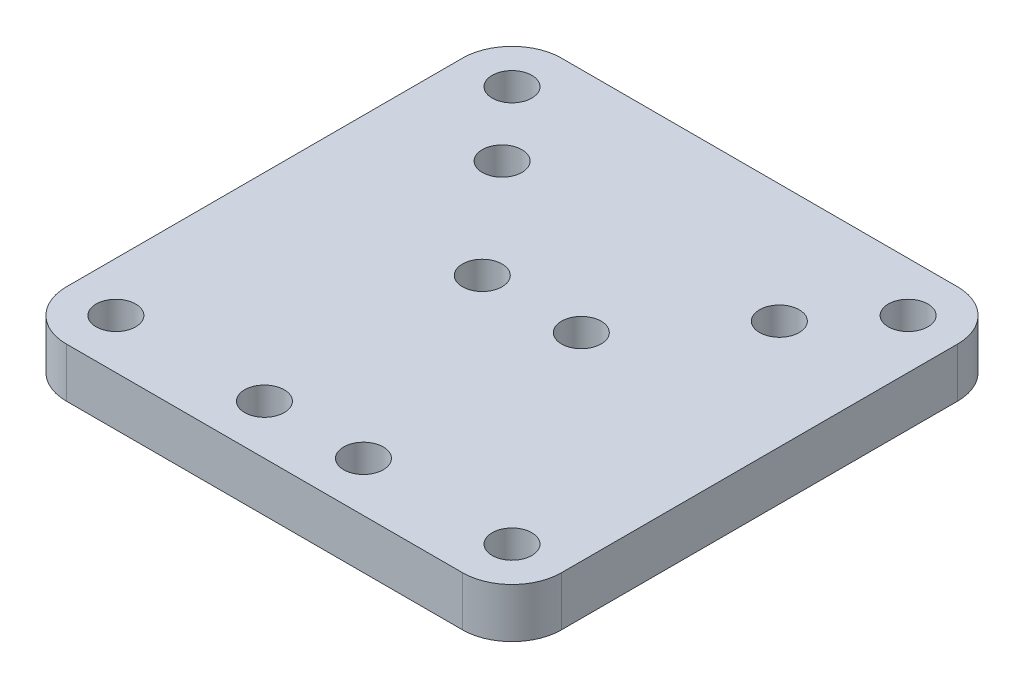
ISO-10303-21;
HEADER;
FILE_DESCRIPTION(('STEP AP214'),'2;1');
FILE_NAME('part.step','',(''),(''),'','','');
FILE_SCHEMA(('AUTOMOTIVE_DESIGN { 1 0 10303 214 1 1 1 1 }'));
ENDSEC;
DATA;
#1=APPLICATION_CONTEXT('core data for automotive mechanical design processes');
#2=APPLICATION_PROTOCOL_DEFINITION('international standard','automotive_design',2000,#1);
#3=PRODUCT_CONTEXT('',#1,'mechanical');
#4=PRODUCT('Part','Part','',(#3));
#5=PRODUCT_RELATED_PRODUCT_CATEGORY('part','',(#4));
#6=PRODUCT_DEFINITION_FORMATION('','',#4);
#7=PRODUCT_DEFINITION_CONTEXT('part definition',#1,'design');
#8=PRODUCT_DEFINITION('design','',#6,#7);
#9=PRODUCT_DEFINITION_SHAPE('','',#8);
#10=(LENGTH_UNIT() NAMED_UNIT(*) SI_UNIT(.MILLI.,.METRE.));
#11=(NAMED_UNIT(*) PLANE_ANGLE_UNIT() SI_UNIT($,.RADIAN.));
#12=(NAMED_UNIT(*) SI_UNIT($,.STERADIAN.) SOLID_ANGLE_UNIT());
#13=UNCERTAINTY_MEASURE_WITH_UNIT(LENGTH_MEASURE(1.E-05),#10,'distance_accuracy_value','');
#14=(GEOMETRIC_REPRESENTATION_CONTEXT(3) GLOBAL_UNCERTAINTY_ASSIGNED_CONTEXT((#13)) GLOBAL_UNIT_ASSIGNED_CONTEXT((#10,
#11,#12)) REPRESENTATION_CONTEXT('',''));
#15=CARTESIAN_POINT('',(0.,0.,0.));
#16=DIRECTION('',(0.,0.,1.));
#17=DIRECTION('',(1.,0.,0.));
#18=AXIS2_PLACEMENT_3D('',#15,#16,#17);
#19=CARTESIAN_POINT('',(0.,5.,0.));
#20=DIRECTION('',(0.,1.,0.));
#21=DIRECTION('',(0.,0.,1.));
#22=AXIS2_PLACEMENT_3D('',#19,#20,#21);
#23=PLANE('',#22);
#24=CARTESIAN_POINT('',(-20.,5.,20.));
#25=DIRECTION('',(0.,1.,0.));
#26=DIRECTION('',(0.,0.,1.));
#27=AXIS2_PLACEMENT_3D('',#24,#25,#26);
#28=CIRCLE('',#27,2.);
#29=CARTESIAN_POINT('',(-20.,5.,22.));
#30=VERTEX_POINT('',#29);
#31=EDGE_CURVE('E464',#30,#30,#28,.T.);
#32=ORIENTED_EDGE('',*,*,#31,.F.);
#33=EDGE_LOOP('',(#32));
#34=FACE_BOUND('',#33,.T.);
#35=CARTESIAN_POINT('',(20.,5.,20.));
#36=DIRECTION('',(0.,1.,0.));
#37=DIRECTION('',(0.,0.,1.));
#38=AXIS2_PLACEMENT_3D('',#35,#36,#37);
#39=CIRCLE('',#38,2.);
#40=CARTESIAN_POINT('',(20.,5.,22.));
#41=VERTEX_POINT('',#40);
#42=EDGE_CURVE('E466',#41,#41,#39,.T.);
#43=ORIENTED_EDGE('',*,*,#42,.F.);
#44=EDGE_LOOP('',(#43));
#45=FACE_BOUND('',#44,.T.);
#46=CARTESIAN_POINT('',(20.,5.,-20.));
#47=DIRECTION('',(0.,1.,0.));
#48=DIRECTION('',(0.,0.,1.));
#49=AXIS2_PLACEMENT_3D('',#46,#47,#48);
#50=CIRCLE('',#49,2.);
#51=CARTESIAN_POINT('',(20.,5.,-18.));
#52=VERTEX_POINT('',#51);
#53=EDGE_CURVE('E472',#52,#52,#50,.T.);
#54=ORIENTED_EDGE('',*,*,#53,.F.);
#55=EDGE_LOOP('',(#54));
#56=FACE_BOUND('',#55,.T.);
#57=CARTESIAN_POINT('',(14.,5.,-13.));
#58=DIRECTION('',(0.,1.,0.));
#59=DIRECTION('',(0.,0.,1.));
#60=AXIS2_PLACEMENT_3D('',#57,#58,#59);
#61=CIRCLE('',#60,2.00000000000001);
#62=CARTESIAN_POINT('',(14.,5.,-11.));
#63=VERTEX_POINT('',#62);
#64=EDGE_CURVE('E480',#63,#63,#61,.T.);
#65=ORIENTED_EDGE('',*,*,#64,.F.);
#66=EDGE_LOOP('',(#65));
#67=FACE_BOUND('',#66,.T.);
#68=CARTESIAN_POINT('',(-14.,5.,-13.));
#69=DIRECTION('',(0.,1.,0.));
#70=DIRECTION('',(0.,0.,1.));
#71=AXIS2_PLACEMENT_3D('',#68,#69,#70);
#72=CIRCLE('',#71,2.);
#73=CARTESIAN_POINT('',(-14.,5.,-11.));
#74=VERTEX_POINT('',#73);
#75=EDGE_CURVE('E475',#74,#74,#72,.T.);
#76=ORIENTED_EDGE('',*,*,#75,.F.);
#77=EDGE_LOOP('',(#76));
#78=FACE_BOUND('',#77,.T.);
#79=CARTESIAN_POINT('',(-20.,5.,-20.));
#80=DIRECTION('',(0.,1.,0.));
#81=DIRECTION('',(0.,0.,1.));
#82=AXIS2_PLACEMENT_3D('',#79,#80,#81);
#83=CIRCLE('',#82,2.);
#84=CARTESIAN_POINT('',(-20.,5.,-18.));
#85=VERTEX_POINT('',#84);
#86=EDGE_CURVE('E188',#85,#85,#83,.T.);
#87=ORIENTED_EDGE('',*,*,#86,.F.);
#88=EDGE_LOOP('',(#87));
#89=FACE_BOUND('',#88,.T.);
#90=CARTESIAN_POINT('',(-4.99999999999999,5.,-1.99999999999999));
#91=DIRECTION('',(0.,1.,0.));
#92=DIRECTION('',(0.,0.,1.));
#93=AXIS2_PLACEMENT_3D('',#90,#91,#92);
#94=CIRCLE('',#93,2.);
#95=CARTESIAN_POINT('',(-4.99999999999999,5.,0.));
#96=VERTEX_POINT('',#95);
#97=EDGE_CURVE('E221',#96,#96,#94,.T.);
#98=ORIENTED_EDGE('',*,*,#97,.F.);
#99=EDGE_LOOP('',(#98));
#100=FACE_BOUND('',#99,.T.);
#101=CARTESIAN_POINT('',(-4.99999999999999,5.,20.));
#102=DIRECTION('',(0.,1.,0.));
#103=DIRECTION('',(0.,0.,1.));
#104=AXIS2_PLACEMENT_3D('',#101,#102,#103);
#105=CIRCLE('',#104,2.);
#106=CARTESIAN_POINT('',(-4.99999999999999,5.,22.));
#107=VERTEX_POINT('',#106);
#108=EDGE_CURVE('E237',#107,#107,#105,.T.);
#109=ORIENTED_EDGE('',*,*,#108,.F.);
#110=EDGE_LOOP('',(#109));
#111=FACE_BOUND('',#110,.T.);
#112=DIRECTION('',(1.,0.,0.));
#113=VECTOR('',#112,1.);
#114=CARTESIAN_POINT('',(25.,5.,25.));
#115=LINE('',#114,#113);
#116=CARTESIAN_POINT('',(-20.,5.,25.));
#117=VERTEX_POINT('',#116);
#118=CARTESIAN_POINT('',(20.,5.,25.));
#119=VERTEX_POINT('',#118);
#120=EDGE_CURVE('E247',#117,#119,#115,.T.);
#121=ORIENTED_EDGE('',*,*,#120,.T.);
#122=CARTESIAN_POINT('',(20.,5.,20.));
#123=DIRECTION('',(0.,1.,0.));
#124=DIRECTION('',(0.,0.,1.));
#125=AXIS2_PLACEMENT_3D('',#122,#123,#124);
#126=CIRCLE('',#125,5.);
#127=CARTESIAN_POINT('',(25.,5.,20.));
#128=VERTEX_POINT('',#127);
#129=EDGE_CURVE('E171',#119,#128,#126,.T.);
#130=ORIENTED_EDGE('',*,*,#129,.T.);
#131=DIRECTION('',(0.,0.,-1.));
#132=VECTOR('',#131,1.);
#133=CARTESIAN_POINT('',(25.,5.,25.));
#134=LINE('',#133,#132);
#135=CARTESIAN_POINT('',(25.,5.,-20.));
#136=VERTEX_POINT('',#135);
#137=EDGE_CURVE('E128',#128,#136,#134,.T.);
#138=ORIENTED_EDGE('',*,*,#137,.T.);
#139=CARTESIAN_POINT('',(20.,5.,-20.));
#140=DIRECTION('',(0.,1.,0.));
#141=DIRECTION('',(0.,0.,1.));
#142=AXIS2_PLACEMENT_3D('',#139,#140,#141);
#143=CIRCLE('',#142,5.);
#144=CARTESIAN_POINT('',(20.,5.,-25.));
#145=VERTEX_POINT('',#144);
#146=EDGE_CURVE('E64',#136,#145,#143,.T.);
#147=ORIENTED_EDGE('',*,*,#146,.T.);
#148=DIRECTION('',(-1.,0.,0.));
#149=VECTOR('',#148,1.);
#150=CARTESIAN_POINT('',(25.,5.,-25.));
#151=LINE('',#150,#149);
#152=CARTESIAN_POINT('',(-20.,5.,-25.));
#153=VERTEX_POINT('',#152);
#154=EDGE_CURVE('E149',#145,#153,#151,.T.);
#155=ORIENTED_EDGE('',*,*,#154,.T.);
#156=CARTESIAN_POINT('',(-20.,5.,-20.));
#157=DIRECTION('',(0.,1.,0.));
#158=DIRECTION('',(0.,0.,1.));
#159=AXIS2_PLACEMENT_3D('',#156,#157,#158);
#160=CIRCLE('',#159,5.);
#161=CARTESIAN_POINT('',(-25.,5.,-20.));
#162=VERTEX_POINT('',#161);
#163=EDGE_CURVE('E163',#153,#162,#160,.T.);
#164=ORIENTED_EDGE('',*,*,#163,.T.);
#165=DIRECTION('',(0.,0.,1.));
#166=VECTOR('',#165,1.);
#167=CARTESIAN_POINT('',(-25.,5.,25.));
#168=LINE('',#167,#166);
#169=CARTESIAN_POINT('',(-25.,5.,20.));
#170=VERTEX_POINT('',#169);
#171=EDGE_CURVE('E142',#162,#170,#168,.T.);
#172=ORIENTED_EDGE('',*,*,#171,.T.);
#173=CARTESIAN_POINT('',(-20.,5.,20.));
#174=DIRECTION('',(0.,1.,0.));
#175=DIRECTION('',(0.,0.,1.));
#176=AXIS2_PLACEMENT_3D('',#173,#174,#175);
#177=CIRCLE('',#176,5.);
#178=EDGE_CURVE('E166',#170,#117,#177,.T.);
#179=ORIENTED_EDGE('',*,*,#178,.T.);
#180=EDGE_LOOP('',(#121,#130,#138,#147,#155,#164,#172,#179));
#181=FACE_BOUND('',#180,.T.);
#182=CARTESIAN_POINT('',(5.00000000000001,5.,20.));
#183=DIRECTION('',(0.,1.,0.));
#184=DIRECTION('',(0.,0.,1.));
#185=AXIS2_PLACEMENT_3D('',#182,#183,#184);
#186=CIRCLE('',#185,2.);
#187=CARTESIAN_POINT('',(5.00000000000001,5.,22.));
#188=VERTEX_POINT('',#187);
#189=EDGE_CURVE('E229',#188,#188,#186,.T.);
#190=ORIENTED_EDGE('',*,*,#189,.F.);
#191=EDGE_LOOP('',(#190));
#192=FACE_BOUND('',#191,.T.);
#193=CARTESIAN_POINT('',(5.,5.,-1.99999999999999));
#194=DIRECTION('',(0.,1.,0.));
#195=DIRECTION('',(0.,0.,1.));
#196=AXIS2_PLACEMENT_3D('',#193,#194,#195);
#197=CIRCLE('',#196,2.);
#198=CARTESIAN_POINT('',(5.,5.,0.));
#199=VERTEX_POINT('',#198);
#200=EDGE_CURVE('E211',#199,#199,#197,.T.);
#201=ORIENTED_EDGE('',*,*,#200,.F.);
#202=EDGE_LOOP('',(#201));
#203=FACE_BOUND('',#202,.T.);
#204=ADVANCED_FACE('F39',(#34,#45,#56,#67,#78,#89,#100,#111,#181,#192,#203),#23,.T.);
#205=CARTESIAN_POINT('',(0.,0.,0.));
#206=DIRECTION('',(0.,1.,0.));
#207=DIRECTION('',(0.,0.,1.));
#208=AXIS2_PLACEMENT_3D('',#205,#206,#207);
#209=PLANE('',#208);
#210=CARTESIAN_POINT('',(-20.,0.,20.));
#211=DIRECTION('',(0.,1.,0.));
#212=DIRECTION('',(0.,0.,1.));
#213=AXIS2_PLACEMENT_3D('',#210,#211,#212);
#214=CIRCLE('',#213,2.);
#215=CARTESIAN_POINT('',(-20.,0.,22.));
#216=VERTEX_POINT('',#215);
#217=EDGE_CURVE('E43',#216,#216,#214,.T.);
#218=ORIENTED_EDGE('',*,*,#217,.T.);
#219=EDGE_LOOP('',(#218));
#220=FACE_BOUND('',#219,.T.);
#221=CARTESIAN_POINT('',(20.,0.,20.));
#222=DIRECTION('',(0.,1.,0.));
#223=DIRECTION('',(0.,0.,1.));
#224=AXIS2_PLACEMENT_3D('',#221,#222,#223);
#225=CIRCLE('',#224,2.);
#226=CARTESIAN_POINT('',(20.,0.,22.));
#227=VERTEX_POINT('',#226);
#228=EDGE_CURVE('E199',#227,#227,#225,.T.);
#229=ORIENTED_EDGE('',*,*,#228,.T.);
#230=EDGE_LOOP('',(#229));
#231=FACE_BOUND('',#230,.T.);
#232=CARTESIAN_POINT('',(20.,0.,-20.));
#233=DIRECTION('',(0.,1.,0.));
#234=DIRECTION('',(0.,0.,1.));
#235=AXIS2_PLACEMENT_3D('',#232,#233,#234);
#236=CIRCLE('',#235,2.);
#237=CARTESIAN_POINT('',(20.,0.,-18.));
#238=VERTEX_POINT('',#237);
#239=EDGE_CURVE('E196',#238,#238,#236,.T.);
#240=ORIENTED_EDGE('',*,*,#239,.T.);
#241=EDGE_LOOP('',(#240));
#242=FACE_BOUND('',#241,.T.);
#243=CARTESIAN_POINT('',(14.,0.,-13.));
#244=DIRECTION('',(0.,1.,0.));
#245=DIRECTION('',(0.,0.,1.));
#246=AXIS2_PLACEMENT_3D('',#243,#244,#245);
#247=CIRCLE('',#246,2.00000000000001);
#248=CARTESIAN_POINT('',(14.,0.,-11.));
#249=VERTEX_POINT('',#248);
#250=EDGE_CURVE('E192',#249,#249,#247,.T.);
#251=ORIENTED_EDGE('',*,*,#250,.T.);
#252=EDGE_LOOP('',(#251));
#253=FACE_BOUND('',#252,.T.);
#254=CARTESIAN_POINT('',(-14.,0.,-13.));
#255=DIRECTION('',(0.,1.,0.));
#256=DIRECTION('',(0.,0.,1.));
#257=AXIS2_PLACEMENT_3D('',#254,#255,#256);
#258=CIRCLE('',#257,2.);
#259=CARTESIAN_POINT('',(-14.,0.,-11.));
#260=VERTEX_POINT('',#259);
#261=EDGE_CURVE('E187',#260,#260,#258,.T.);
#262=ORIENTED_EDGE('',*,*,#261,.T.);
#263=EDGE_LOOP('',(#262));
#264=FACE_BOUND('',#263,.T.);
#265=CARTESIAN_POINT('',(-20.,0.,-20.));
#266=DIRECTION('',(0.,1.,0.));
#267=DIRECTION('',(0.,0.,1.));
#268=AXIS2_PLACEMENT_3D('',#265,#266,#267);
#269=CIRCLE('',#268,2.);
#270=CARTESIAN_POINT('',(-20.,0.,-18.));
#271=VERTEX_POINT('',#270);
#272=EDGE_CURVE('E183',#271,#271,#269,.T.);
#273=ORIENTED_EDGE('',*,*,#272,.T.);
#274=EDGE_LOOP('',(#273));
#275=FACE_BOUND('',#274,.T.);
#276=DIRECTION('',(0.,0.,-1.));
#277=VECTOR('',#276,1.);
#278=CARTESIAN_POINT('',(25.,0.,25.));
#279=LINE('',#278,#277);
#280=CARTESIAN_POINT('',(25.,0.,20.));
#281=VERTEX_POINT('',#280);
#282=CARTESIAN_POINT('',(25.,0.,-20.));
#283=VERTEX_POINT('',#282);
#284=EDGE_CURVE('E126',#281,#283,#279,.T.);
#285=ORIENTED_EDGE('',*,*,#284,.F.);
#286=CARTESIAN_POINT('',(20.,0.,20.));
#287=DIRECTION('',(0.,1.,0.));
#288=DIRECTION('',(0.,0.,1.));
#289=AXIS2_PLACEMENT_3D('',#286,#287,#288);
#290=CIRCLE('',#289,5.);
#291=CARTESIAN_POINT('',(20.,0.,25.));
#292=VERTEX_POINT('',#291);
#293=EDGE_CURVE('E108',#281,#292,#290,.F.);
#294=ORIENTED_EDGE('',*,*,#293,.T.);
#295=DIRECTION('',(1.,0.,0.));
#296=VECTOR('',#295,1.);
#297=CARTESIAN_POINT('',(25.,0.,25.));
#298=LINE('',#297,#296);
#299=CARTESIAN_POINT('',(-20.,0.,25.));
#300=VERTEX_POINT('',#299);
#301=EDGE_CURVE('E138',#300,#292,#298,.T.);
#302=ORIENTED_EDGE('',*,*,#301,.F.);
#303=CARTESIAN_POINT('',(-20.,0.,20.));
#304=DIRECTION('',(0.,1.,0.));
#305=DIRECTION('',(0.,0.,1.));
#306=AXIS2_PLACEMENT_3D('',#303,#304,#305);
#307=CIRCLE('',#306,5.);
#308=CARTESIAN_POINT('',(-25.,0.,20.));
#309=VERTEX_POINT('',#308);
#310=EDGE_CURVE('E153',#300,#309,#307,.F.);
#311=ORIENTED_EDGE('',*,*,#310,.T.);
#312=DIRECTION('',(0.,0.,1.));
#313=VECTOR('',#312,1.);
#314=CARTESIAN_POINT('',(-25.,0.,25.));
#315=LINE('',#314,#313);
#316=CARTESIAN_POINT('',(-25.,0.,-20.));
#317=VERTEX_POINT('',#316);
#318=EDGE_CURVE('E144',#317,#309,#315,.T.);
#319=ORIENTED_EDGE('',*,*,#318,.F.);
#320=CARTESIAN_POINT('',(-20.,0.,-20.));
#321=DIRECTION('',(0.,1.,0.));
#322=DIRECTION('',(0.,0.,1.));
#323=AXIS2_PLACEMENT_3D('',#320,#321,#322);
#324=CIRCLE('',#323,5.);
#325=CARTESIAN_POINT('',(-20.,0.,-25.));
#326=VERTEX_POINT('',#325);
#327=EDGE_CURVE('E130',#317,#326,#324,.F.);
#328=ORIENTED_EDGE('',*,*,#327,.T.);
#329=DIRECTION('',(-1.,0.,0.));
#330=VECTOR('',#329,1.);
#331=CARTESIAN_POINT('',(25.,0.,-25.));
#332=LINE('',#331,#330);
#333=CARTESIAN_POINT('',(20.,0.,-25.));
#334=VERTEX_POINT('',#333);
#335=EDGE_CURVE('E137',#334,#326,#332,.T.);
#336=ORIENTED_EDGE('',*,*,#335,.F.);
#337=CARTESIAN_POINT('',(20.,0.,-20.));
#338=DIRECTION('',(0.,1.,0.));
#339=DIRECTION('',(0.,0.,1.));
#340=AXIS2_PLACEMENT_3D('',#337,#338,#339);
#341=CIRCLE('',#340,5.);
#342=EDGE_CURVE('E120',#334,#283,#341,.F.);
#343=ORIENTED_EDGE('',*,*,#342,.T.);
#344=EDGE_LOOP('',(#285,#294,#302,#311,#319,#328,#336,#343));
#345=FACE_BOUND('',#344,.T.);
#346=CARTESIAN_POINT('',(-4.99999999999999,0.,20.));
#347=DIRECTION('',(0.,1.,0.));
#348=DIRECTION('',(0.,0.,1.));
#349=AXIS2_PLACEMENT_3D('',#346,#347,#348);
#350=CIRCLE('',#349,2.);
#351=CARTESIAN_POINT('',(-4.99999999999999,0.,22.));
#352=VERTEX_POINT('',#351);
#353=EDGE_CURVE('E233',#352,#352,#350,.T.);
#354=ORIENTED_EDGE('',*,*,#353,.T.);
#355=EDGE_LOOP('',(#354));
#356=FACE_BOUND('',#355,.T.);
#357=CARTESIAN_POINT('',(5.00000000000001,0.,20.));
#358=DIRECTION('',(0.,1.,0.));
#359=DIRECTION('',(0.,0.,1.));
#360=AXIS2_PLACEMENT_3D('',#357,#358,#359);
#361=CIRCLE('',#360,2.);
#362=CARTESIAN_POINT('',(5.00000000000001,0.,22.));
#363=VERTEX_POINT('',#362);
#364=EDGE_CURVE('E225',#363,#363,#361,.T.);
#365=ORIENTED_EDGE('',*,*,#364,.T.);
#366=EDGE_LOOP('',(#365));
#367=FACE_BOUND('',#366,.T.);
#368=CARTESIAN_POINT('',(-4.99999999999999,0.,-1.99999999999999));
#369=DIRECTION('',(0.,1.,0.));
#370=DIRECTION('',(0.,0.,1.));
#371=AXIS2_PLACEMENT_3D('',#368,#369,#370);
#372=CIRCLE('',#371,2.);
#373=CARTESIAN_POINT('',(-4.99999999999999,0.,0.));
#374=VERTEX_POINT('',#373);
#375=EDGE_CURVE('E217',#374,#374,#372,.T.);
#376=ORIENTED_EDGE('',*,*,#375,.T.);
#377=EDGE_LOOP('',(#376));
#378=FACE_BOUND('',#377,.T.);
#379=CARTESIAN_POINT('',(5.,0.,-1.99999999999999));
#380=DIRECTION('',(0.,1.,0.));
#381=DIRECTION('',(0.,0.,1.));
#382=AXIS2_PLACEMENT_3D('',#379,#380,#381);
#383=CIRCLE('',#382,2.);
#384=CARTESIAN_POINT('',(5.,0.,0.));
#385=VERTEX_POINT('',#384);
#386=EDGE_CURVE('E206',#385,#385,#383,.T.);
#387=ORIENTED_EDGE('',*,*,#386,.T.);
#388=EDGE_LOOP('',(#387));
#389=FACE_BOUND('',#388,.T.);
#390=ADVANCED_FACE('F133',(#220,#231,#242,#253,#264,#275,#345,#356,#367,#378,#389),#209,.F.);
#391=CARTESIAN_POINT('',(-25.,5.,25.));
#392=DIRECTION('',(1.,0.,0.));
#393=DIRECTION('',(0.,0.,-1.));
#394=AXIS2_PLACEMENT_3D('',#391,#392,#393);
#395=PLANE('',#394);
#396=ORIENTED_EDGE('',*,*,#318,.T.);
#397=DIRECTION('',(0.,-1.,0.));
#398=VECTOR('',#397,1.);
#399=CARTESIAN_POINT('',(-25.,5.,20.));
#400=LINE('',#399,#398);
#401=EDGE_CURVE('E11',#309,#170,#400,.F.);
#402=ORIENTED_EDGE('',*,*,#401,.T.);
#403=ORIENTED_EDGE('',*,*,#171,.F.);
#404=DIRECTION('',(0.,-1.,0.));
#405=VECTOR('',#404,1.);
#406=CARTESIAN_POINT('',(-25.,5.,-20.));
#407=LINE('',#406,#405);
#408=EDGE_CURVE('E49',#162,#317,#407,.T.);
#409=ORIENTED_EDGE('',*,*,#408,.T.);
#410=EDGE_LOOP('',(#396,#402,#403,#409));
#411=FACE_BOUND('',#410,.T.);
#412=ADVANCED_FACE('F259',(#411),#395,.F.);
#413=CARTESIAN_POINT('',(25.,5.,25.));
#414=DIRECTION('',(0.,0.,-1.));
#415=DIRECTION('',(-1.,0.,0.));
#416=AXIS2_PLACEMENT_3D('',#413,#414,#415);
#417=PLANE('',#416);
#418=ORIENTED_EDGE('',*,*,#301,.T.);
#419=DIRECTION('',(0.,-1.,0.));
#420=VECTOR('',#419,1.);
#421=CARTESIAN_POINT('',(20.,5.,25.));
#422=LINE('',#421,#420);
#423=EDGE_CURVE('E113',#292,#119,#422,.F.);
#424=ORIENTED_EDGE('',*,*,#423,.T.);
#425=ORIENTED_EDGE('',*,*,#120,.F.);
#426=DIRECTION('',(0.,-1.,0.));
#427=VECTOR('',#426,1.);
#428=CARTESIAN_POINT('',(-20.,5.,25.));
#429=LINE('',#428,#427);
#430=EDGE_CURVE('E119',#117,#300,#429,.T.);
#431=ORIENTED_EDGE('',*,*,#430,.T.);
#432=EDGE_LOOP('',(#418,#424,#425,#431));
#433=FACE_BOUND('',#432,.T.);
#434=ADVANCED_FACE('F269',(#433),#417,.F.);
#435=CARTESIAN_POINT('',(25.,5.,25.));
#436=DIRECTION('',(-1.,0.,0.));
#437=DIRECTION('',(0.,0.,1.));
#438=AXIS2_PLACEMENT_3D('',#435,#436,#437);
#439=PLANE('',#438);
#440=ORIENTED_EDGE('',*,*,#137,.F.);
#441=DIRECTION('',(0.,-1.,0.));
#442=VECTOR('',#441,1.);
#443=CARTESIAN_POINT('',(25.,5.,20.));
#444=LINE('',#443,#442);
#445=EDGE_CURVE('E112',#128,#281,#444,.T.);
#446=ORIENTED_EDGE('',*,*,#445,.T.);
#447=ORIENTED_EDGE('',*,*,#284,.T.);
#448=DIRECTION('',(0.,-1.,0.));
#449=VECTOR('',#448,1.);
#450=CARTESIAN_POINT('',(25.,5.,-20.));
#451=LINE('',#450,#449);
#452=EDGE_CURVE('E131',#283,#136,#451,.F.);
#453=ORIENTED_EDGE('',*,*,#452,.T.);
#454=EDGE_LOOP('',(#440,#446,#447,#453));
#455=FACE_BOUND('',#454,.T.);
#456=ADVANCED_FACE('F125',(#455),#439,.F.);
#457=CARTESIAN_POINT('',(25.,5.,-25.));
#458=DIRECTION('',(0.,0.,1.));
#459=DIRECTION('',(1.,0.,0.));
#460=AXIS2_PLACEMENT_3D('',#457,#458,#459);
#461=PLANE('',#460);
#462=ORIENTED_EDGE('',*,*,#154,.F.);
#463=DIRECTION('',(0.,-1.,0.));
#464=VECTOR('',#463,1.);
#465=CARTESIAN_POINT('',(20.,5.,-25.));
#466=LINE('',#465,#464);
#467=EDGE_CURVE('E176',#145,#334,#466,.T.);
#468=ORIENTED_EDGE('',*,*,#467,.T.);
#469=ORIENTED_EDGE('',*,*,#335,.T.);
#470=DIRECTION('',(0.,-1.,0.));
#471=VECTOR('',#470,1.);
#472=CARTESIAN_POINT('',(-20.,5.,-25.));
#473=LINE('',#472,#471);
#474=EDGE_CURVE('E57',#326,#153,#473,.F.);
#475=ORIENTED_EDGE('',*,*,#474,.T.);
#476=EDGE_LOOP('',(#462,#468,#469,#475));
#477=FACE_BOUND('',#476,.T.);
#478=ADVANCED_FACE('F276',(#477),#461,.F.);
#479=CARTESIAN_POINT('',(-4.99999999999999,5.,20.));
#480=DIRECTION('',(0.,-1.,0.));
#481=DIRECTION('',(0.,0.,-1.));
#482=AXIS2_PLACEMENT_3D('',#479,#480,#481);
#483=CYLINDRICAL_SURFACE('',#482,2.);
#484=ORIENTED_EDGE('',*,*,#108,.T.);
#485=EDGE_LOOP('',(#484));
#486=FACE_BOUND('',#485,.T.);
#487=ORIENTED_EDGE('',*,*,#353,.F.);
#488=EDGE_LOOP('',(#487));
#489=FACE_BOUND('',#488,.T.);
#490=ADVANCED_FACE('F289',(#486,#489),#483,.F.);
#491=CARTESIAN_POINT('',(5.00000000000001,5.,20.));
#492=DIRECTION('',(0.,-1.,0.));
#493=DIRECTION('',(0.,0.,-1.));
#494=AXIS2_PLACEMENT_3D('',#491,#492,#493);
#495=CYLINDRICAL_SURFACE('',#494,2.);
#496=ORIENTED_EDGE('',*,*,#189,.T.);
#497=EDGE_LOOP('',(#496));
#498=FACE_BOUND('',#497,.T.);
#499=ORIENTED_EDGE('',*,*,#364,.F.);
#500=EDGE_LOOP('',(#499));
#501=FACE_BOUND('',#500,.T.);
#502=ADVANCED_FACE('F296',(#498,#501),#495,.F.);
#503=CARTESIAN_POINT('',(-4.99999999999999,5.,-1.99999999999999));
#504=DIRECTION('',(0.,-1.,0.));
#505=DIRECTION('',(0.,0.,-1.));
#506=AXIS2_PLACEMENT_3D('',#503,#504,#505);
#507=CYLINDRICAL_SURFACE('',#506,2.);
#508=ORIENTED_EDGE('',*,*,#97,.T.);
#509=EDGE_LOOP('',(#508));
#510=FACE_BOUND('',#509,.T.);
#511=ORIENTED_EDGE('',*,*,#375,.F.);
#512=EDGE_LOOP('',(#511));
#513=FACE_BOUND('',#512,.T.);
#514=ADVANCED_FACE('F313',(#510,#513),#507,.F.);
#515=CARTESIAN_POINT('',(5.,5.,-1.99999999999999));
#516=DIRECTION('',(0.,-1.,0.));
#517=DIRECTION('',(0.,0.,-1.));
#518=AXIS2_PLACEMENT_3D('',#515,#516,#517);
#519=CYLINDRICAL_SURFACE('',#518,2.);
#520=ORIENTED_EDGE('',*,*,#200,.T.);
#521=EDGE_LOOP('',(#520));
#522=FACE_BOUND('',#521,.T.);
#523=ORIENTED_EDGE('',*,*,#386,.F.);
#524=EDGE_LOOP('',(#523));
#525=FACE_BOUND('',#524,.T.);
#526=ADVANCED_FACE('F308',(#522,#525),#519,.F.);
#527=CARTESIAN_POINT('',(20.,5.,20.));
#528=DIRECTION('',(0.,-1.,0.));
#529=DIRECTION('',(0.,0.,-1.));
#530=AXIS2_PLACEMENT_3D('',#527,#528,#529);
#531=CYLINDRICAL_SURFACE('',#530,5.);
#532=ORIENTED_EDGE('',*,*,#129,.F.);
#533=ORIENTED_EDGE('',*,*,#423,.F.);
#534=ORIENTED_EDGE('',*,*,#293,.F.);
#535=ORIENTED_EDGE('',*,*,#445,.F.);
#536=EDGE_LOOP('',(#532,#533,#534,#535));
#537=FACE_BOUND('',#536,.T.);
#538=ADVANCED_FACE('F111',(#537),#531,.T.);
#539=CARTESIAN_POINT('',(20.,5.,-20.));
#540=DIRECTION('',(0.,-1.,0.));
#541=DIRECTION('',(0.,0.,-1.));
#542=AXIS2_PLACEMENT_3D('',#539,#540,#541);
#543=CYLINDRICAL_SURFACE('',#542,5.);
#544=ORIENTED_EDGE('',*,*,#146,.F.);
#545=ORIENTED_EDGE('',*,*,#452,.F.);
#546=ORIENTED_EDGE('',*,*,#342,.F.);
#547=ORIENTED_EDGE('',*,*,#467,.F.);
#548=EDGE_LOOP('',(#544,#545,#546,#547));
#549=FACE_BOUND('',#548,.T.);
#550=ADVANCED_FACE('F301',(#549),#543,.T.);
#551=CARTESIAN_POINT('',(-20.,5.,20.));
#552=DIRECTION('',(0.,-1.,0.));
#553=DIRECTION('',(0.,0.,-1.));
#554=AXIS2_PLACEMENT_3D('',#551,#552,#553);
#555=CYLINDRICAL_SURFACE('',#554,5.);
#556=ORIENTED_EDGE('',*,*,#178,.F.);
#557=ORIENTED_EDGE('',*,*,#401,.F.);
#558=ORIENTED_EDGE('',*,*,#310,.F.);
#559=ORIENTED_EDGE('',*,*,#430,.F.);
#560=EDGE_LOOP('',(#556,#557,#558,#559));
#561=FACE_BOUND('',#560,.T.);
#562=ADVANCED_FACE('F264',(#561),#555,.T.);
#563=CARTESIAN_POINT('',(-20.,5.,-20.));
#564=DIRECTION('',(0.,-1.,0.));
#565=DIRECTION('',(0.,0.,-1.));
#566=AXIS2_PLACEMENT_3D('',#563,#564,#565);
#567=CYLINDRICAL_SURFACE('',#566,5.);
#568=ORIENTED_EDGE('',*,*,#163,.F.);
#569=ORIENTED_EDGE('',*,*,#474,.F.);
#570=ORIENTED_EDGE('',*,*,#327,.F.);
#571=ORIENTED_EDGE('',*,*,#408,.F.);
#572=EDGE_LOOP('',(#568,#569,#570,#571));
#573=FACE_BOUND('',#572,.T.);
#574=ADVANCED_FACE('F41',(#573),#567,.T.);
#575=CARTESIAN_POINT('',(-20.,-5.,-20.));
#576=DIRECTION('',(0.,1.,0.));
#577=DIRECTION('',(0.,0.,1.));
#578=AXIS2_PLACEMENT_3D('',#575,#576,#577);
#579=CYLINDRICAL_SURFACE('',#578,2.);
#580=ORIENTED_EDGE('',*,*,#86,.T.);
#581=EDGE_LOOP('',(#580));
#582=FACE_BOUND('',#581,.T.);
#583=ORIENTED_EDGE('',*,*,#272,.F.);
#584=EDGE_LOOP('',(#583));
#585=FACE_BOUND('',#584,.T.);
#586=ADVANCED_FACE('F323',(#582,#585),#579,.F.);
#587=CARTESIAN_POINT('',(-14.,-5.,-13.));
#588=DIRECTION('',(0.,1.,0.));
#589=DIRECTION('',(0.,0.,1.));
#590=AXIS2_PLACEMENT_3D('',#587,#588,#589);
#591=CYLINDRICAL_SURFACE('',#590,2.);
#592=ORIENTED_EDGE('',*,*,#75,.T.);
#593=EDGE_LOOP('',(#592));
#594=FACE_BOUND('',#593,.T.);
#595=ORIENTED_EDGE('',*,*,#261,.F.);
#596=EDGE_LOOP('',(#595));
#597=FACE_BOUND('',#596,.T.);
#598=ADVANCED_FACE('F410',(#594,#597),#591,.F.);
#599=CARTESIAN_POINT('',(14.,-5.,-13.));
#600=DIRECTION('',(0.,1.,0.));
#601=DIRECTION('',(0.,0.,1.));
#602=AXIS2_PLACEMENT_3D('',#599,#600,#601);
#603=CYLINDRICAL_SURFACE('',#602,2.00000000000001);
#604=ORIENTED_EDGE('',*,*,#64,.T.);
#605=EDGE_LOOP('',(#604));
#606=FACE_BOUND('',#605,.T.);
#607=ORIENTED_EDGE('',*,*,#250,.F.);
#608=EDGE_LOOP('',(#607));
#609=FACE_BOUND('',#608,.T.);
#610=ADVANCED_FACE('F419',(#606,#609),#603,.F.);
#611=CARTESIAN_POINT('',(20.,-5.,-20.));
#612=DIRECTION('',(0.,1.,0.));
#613=DIRECTION('',(0.,0.,1.));
#614=AXIS2_PLACEMENT_3D('',#611,#612,#613);
#615=CYLINDRICAL_SURFACE('',#614,2.);
#616=ORIENTED_EDGE('',*,*,#53,.T.);
#617=EDGE_LOOP('',(#616));
#618=FACE_BOUND('',#617,.T.);
#619=ORIENTED_EDGE('',*,*,#239,.F.);
#620=EDGE_LOOP('',(#619));
#621=FACE_BOUND('',#620,.T.);
#622=ADVANCED_FACE('F429',(#618,#621),#615,.F.);
#623=CARTESIAN_POINT('',(20.,-5.,20.));
#624=DIRECTION('',(0.,1.,0.));
#625=DIRECTION('',(0.,0.,1.));
#626=AXIS2_PLACEMENT_3D('',#623,#624,#625);
#627=CYLINDRICAL_SURFACE('',#626,2.);
#628=ORIENTED_EDGE('',*,*,#42,.T.);
#629=EDGE_LOOP('',(#628));
#630=FACE_BOUND('',#629,.T.);
#631=ORIENTED_EDGE('',*,*,#228,.F.);
#632=EDGE_LOOP('',(#631));
#633=FACE_BOUND('',#632,.T.);
#634=ADVANCED_FACE('F438',(#630,#633),#627,.F.);
#635=CARTESIAN_POINT('',(-20.,-5.,20.));
#636=DIRECTION('',(0.,1.,0.));
#637=DIRECTION('',(0.,0.,1.));
#638=AXIS2_PLACEMENT_3D('',#635,#636,#637);
#639=CYLINDRICAL_SURFACE('',#638,2.);
#640=ORIENTED_EDGE('',*,*,#31,.T.);
#641=EDGE_LOOP('',(#640));
#642=FACE_BOUND('',#641,.T.);
#643=ORIENTED_EDGE('',*,*,#217,.F.);
#644=EDGE_LOOP('',(#643));
#645=FACE_BOUND('',#644,.T.);
#646=ADVANCED_FACE('F448',(#642,#645),#639,.F.);
#647=CLOSED_SHELL('',(#204,#390,#412,#434,#456,#478,#490,#502,#514,#526,#538,#550,#562,#574,
#586,#598,#610,#622,#634,#646));
#648=MANIFOLD_SOLID_BREP('B2',#647);
#649=ADVANCED_BREP_SHAPE_REPRESENTATION('',(#18,#648),#14);
#650=SHAPE_DEFINITION_REPRESENTATION(#9,#649);
ENDSEC;
END-ISO-10303-21;
